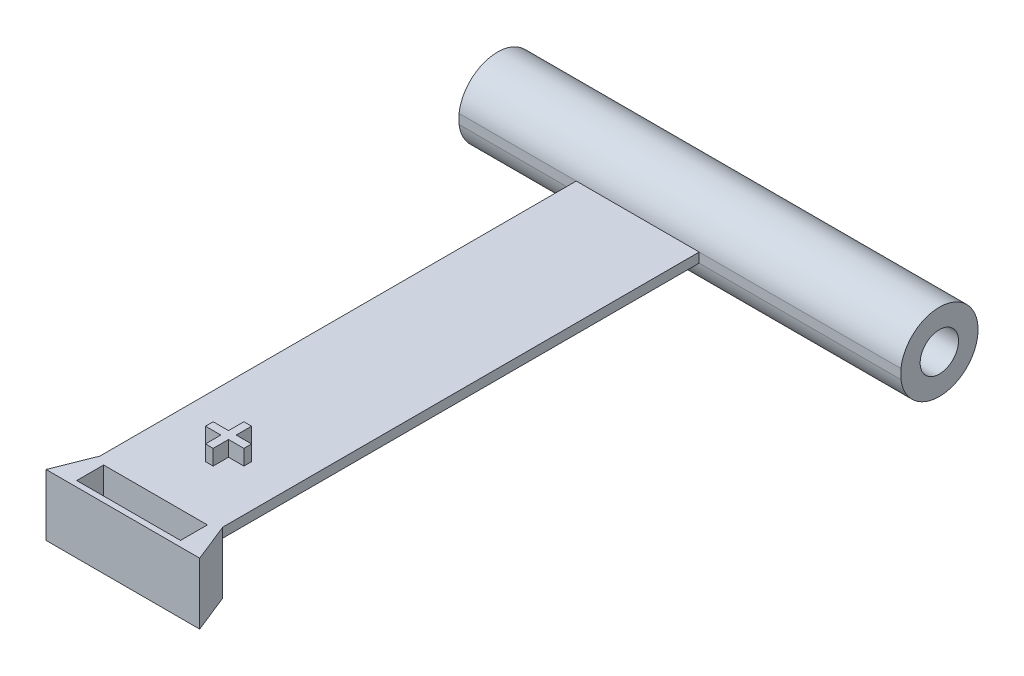
ISO-10303-21;
HEADER;
FILE_DESCRIPTION(('STEP AP214'),'2;1');
FILE_NAME('part.step','',(''),(''),'','','');
FILE_SCHEMA(('AUTOMOTIVE_DESIGN { 1 0 10303 214 1 1 1 1 }'));
ENDSEC;
DATA;
#1=APPLICATION_CONTEXT('core data for automotive mechanical design processes');
#2=APPLICATION_PROTOCOL_DEFINITION('international standard','automotive_design',2000,#1);
#3=PRODUCT_CONTEXT('',#1,'mechanical');
#4=PRODUCT('Part','Part','',(#3));
#5=PRODUCT_RELATED_PRODUCT_CATEGORY('part','',(#4));
#6=PRODUCT_DEFINITION_FORMATION('','',#4);
#7=PRODUCT_DEFINITION_CONTEXT('part definition',#1,'design');
#8=PRODUCT_DEFINITION('design','',#6,#7);
#9=PRODUCT_DEFINITION_SHAPE('','',#8);
#10=(LENGTH_UNIT() NAMED_UNIT(*) SI_UNIT(.MILLI.,.METRE.));
#11=(NAMED_UNIT(*) PLANE_ANGLE_UNIT() SI_UNIT($,.RADIAN.));
#12=(NAMED_UNIT(*) SI_UNIT($,.STERADIAN.) SOLID_ANGLE_UNIT());
#13=UNCERTAINTY_MEASURE_WITH_UNIT(LENGTH_MEASURE(1.E-05),#10,'distance_accuracy_value','');
#14=(GEOMETRIC_REPRESENTATION_CONTEXT(3) GLOBAL_UNCERTAINTY_ASSIGNED_CONTEXT((#13)) GLOBAL_UNIT_ASSIGNED_CONTEXT((#10,
#11,#12)) REPRESENTATION_CONTEXT('',''));
#15=CARTESIAN_POINT('',(0.,0.,0.));
#16=DIRECTION('',(0.,0.,1.));
#17=DIRECTION('',(1.,0.,0.));
#18=AXIS2_PLACEMENT_3D('',#15,#16,#17);
#19=CARTESIAN_POINT('',(0.,32.,0.));
#20=DIRECTION('',(0.,1.,0.));
#21=DIRECTION('',(0.,0.,1.));
#22=AXIS2_PLACEMENT_3D('',#19,#20,#21);
#23=PLANE('',#22);
#24=DIRECTION('',(0.,0.,-1.));
#25=VECTOR('',#24,1.);
#26=CARTESIAN_POINT('',(38.,32.,0.));
#27=LINE('',#26,#25);
#28=CARTESIAN_POINT('',(38.,32.,-45.));
#29=VERTEX_POINT('',#28);
#30=CARTESIAN_POINT('',(38.,32.,-53.));
#31=VERTEX_POINT('',#30);
#32=EDGE_CURVE('E248',#29,#31,#27,.T.);
#33=ORIENTED_EDGE('',*,*,#32,.T.);
#34=DIRECTION('',(-1.,0.,0.));
#35=VECTOR('',#34,1.);
#36=CARTESIAN_POINT('',(0.,32.,-53.));
#37=LINE('',#36,#35);
#38=CARTESIAN_POINT('',(30.,32.,-53.));
#39=VERTEX_POINT('',#38);
#40=EDGE_CURVE('E253',#31,#39,#37,.T.);
#41=ORIENTED_EDGE('',*,*,#40,.T.);
#42=DIRECTION('',(0.,0.,-1.));
#43=VECTOR('',#42,1.);
#44=CARTESIAN_POINT('',(30.,32.,0.));
#45=LINE('',#44,#43);
#46=CARTESIAN_POINT('',(30.,32.,-57.));
#47=VERTEX_POINT('',#46);
#48=EDGE_CURVE('E302',#39,#47,#45,.T.);
#49=ORIENTED_EDGE('',*,*,#48,.T.);
#50=DIRECTION('',(1.,0.,0.));
#51=VECTOR('',#50,1.);
#52=CARTESIAN_POINT('',(0.,32.,-57.));
#53=LINE('',#52,#51);
#54=CARTESIAN_POINT('',(38.,32.,-57.));
#55=VERTEX_POINT('',#54);
#56=EDGE_CURVE('E300',#47,#55,#53,.T.);
#57=ORIENTED_EDGE('',*,*,#56,.T.);
#58=DIRECTION('',(0.,0.,-1.));
#59=VECTOR('',#58,1.);
#60=CARTESIAN_POINT('',(38.,32.,0.));
#61=LINE('',#60,#59);
#62=CARTESIAN_POINT('',(38.,32.,-65.));
#63=VERTEX_POINT('',#62);
#64=EDGE_CURVE('E298',#55,#63,#61,.T.);
#65=ORIENTED_EDGE('',*,*,#64,.T.);
#66=DIRECTION('',(-1.,0.,0.));
#67=VECTOR('',#66,1.);
#68=CARTESIAN_POINT('',(0.,32.,-65.));
#69=LINE('',#68,#67);
#70=CARTESIAN_POINT('',(42.,32.,-65.));
#71=VERTEX_POINT('',#70);
#72=EDGE_CURVE('E295',#71,#63,#69,.T.);
#73=ORIENTED_EDGE('',*,*,#72,.F.);
#74=DIRECTION('',(0.,0.,-1.));
#75=VECTOR('',#74,1.);
#76=CARTESIAN_POINT('',(42.,32.,0.));
#77=LINE('',#76,#75);
#78=CARTESIAN_POINT('',(42.,32.,-57.));
#79=VERTEX_POINT('',#78);
#80=EDGE_CURVE('E292',#79,#71,#77,.T.);
#81=ORIENTED_EDGE('',*,*,#80,.F.);
#82=DIRECTION('',(1.,0.,0.));
#83=VECTOR('',#82,1.);
#84=CARTESIAN_POINT('',(0.,32.,-57.));
#85=LINE('',#84,#83);
#86=CARTESIAN_POINT('',(50.,32.,-57.));
#87=VERTEX_POINT('',#86);
#88=EDGE_CURVE('E290',#79,#87,#85,.T.);
#89=ORIENTED_EDGE('',*,*,#88,.T.);
#90=DIRECTION('',(0.,0.,1.));
#91=VECTOR('',#90,1.);
#92=CARTESIAN_POINT('',(50.,32.,0.));
#93=LINE('',#92,#91);
#94=CARTESIAN_POINT('',(50.,32.,-53.));
#95=VERTEX_POINT('',#94);
#96=EDGE_CURVE('E288',#87,#95,#93,.T.);
#97=ORIENTED_EDGE('',*,*,#96,.T.);
#98=DIRECTION('',(-1.,0.,0.));
#99=VECTOR('',#98,1.);
#100=CARTESIAN_POINT('',(0.,32.,-53.));
#101=LINE('',#100,#99);
#102=CARTESIAN_POINT('',(42.,32.,-53.));
#103=VERTEX_POINT('',#102);
#104=EDGE_CURVE('E286',#95,#103,#101,.T.);
#105=ORIENTED_EDGE('',*,*,#104,.T.);
#106=DIRECTION('',(0.,0.,-1.));
#107=VECTOR('',#106,1.);
#108=CARTESIAN_POINT('',(42.,32.,0.));
#109=LINE('',#108,#107);
#110=CARTESIAN_POINT('',(42.,32.,-45.));
#111=VERTEX_POINT('',#110);
#112=EDGE_CURVE('E59',#111,#103,#109,.T.);
#113=ORIENTED_EDGE('',*,*,#112,.F.);
#114=DIRECTION('',(1.,0.,0.));
#115=VECTOR('',#114,1.);
#116=CARTESIAN_POINT('',(0.,32.,-45.));
#117=LINE('',#116,#115);
#118=EDGE_CURVE('E54',#29,#111,#117,.T.);
#119=ORIENTED_EDGE('',*,*,#118,.F.);
#120=EDGE_LOOP('',(#33,#41,#49,#57,#65,#73,#81,#89,#97,#105,#113,#119));
#121=FACE_BOUND('',#120,.T.);
#122=DIRECTION('',(0.371390676354104,0.,0.928476690885259));
#123=VECTOR('',#122,1.);
#124=CARTESIAN_POINT('',(68.9655172413793,32.,-27.5862068965517));
#125=LINE('',#124,#123);
#126=CARTESIAN_POINT('',(72.,32.,-20.));
#127=VERTEX_POINT('',#126);
#128=CARTESIAN_POINT('',(80.,32.,0.));
#129=VERTEX_POINT('',#128);
#130=EDGE_CURVE('E387',#127,#129,#125,.T.);
#131=ORIENTED_EDGE('',*,*,#130,.F.);
#132=DIRECTION('',(0.,0.,1.));
#133=VECTOR('',#132,1.);
#134=CARTESIAN_POINT('',(72.,32.,-90.0000000000001));
#135=LINE('',#134,#133);
#136=CARTESIAN_POINT('',(72.,32.,-268.));
#137=VERTEX_POINT('',#136);
#138=EDGE_CURVE('E351',#137,#127,#135,.T.);
#139=ORIENTED_EDGE('',*,*,#138,.F.);
#140=DIRECTION('',(1.,0.,0.));
#141=VECTOR('',#140,1.);
#142=CARTESIAN_POINT('',(72.,32.,-268.));
#143=LINE('',#142,#141);
#144=CARTESIAN_POINT('',(8.,32.,-268.));
#145=VERTEX_POINT('',#144);
#146=EDGE_CURVE('E246',#145,#137,#143,.T.);
#147=ORIENTED_EDGE('',*,*,#146,.F.);
#148=DIRECTION('',(0.,0.,1.));
#149=VECTOR('',#148,1.);
#150=CARTESIAN_POINT('',(8.,32.,-90.0000000000001));
#151=LINE('',#150,#149);
#152=CARTESIAN_POINT('',(8.,32.,-20.));
#153=VERTEX_POINT('',#152);
#154=EDGE_CURVE('E342',#145,#153,#151,.T.);
#155=ORIENTED_EDGE('',*,*,#154,.T.);
#156=DIRECTION('',(0.371390676354104,0.,-0.928476690885259));
#157=VECTOR('',#156,1.);
#158=CARTESIAN_POINT('',(0.,32.,0.));
#159=LINE('',#158,#157);
#160=CARTESIAN_POINT('',(0.,32.,0.));
#161=VERTEX_POINT('',#160);
#162=EDGE_CURVE('E390',#161,#153,#159,.T.);
#163=ORIENTED_EDGE('',*,*,#162,.F.);
#164=DIRECTION('',(1.,0.,0.));
#165=VECTOR('',#164,1.);
#166=CARTESIAN_POINT('',(0.,32.,0.));
#167=LINE('',#166,#165);
#168=EDGE_CURVE('E393',#161,#129,#167,.T.);
#169=ORIENTED_EDGE('',*,*,#168,.T.);
#170=EDGE_LOOP('',(#131,#139,#147,#155,#163,#169));
#171=FACE_BOUND('',#170,.T.);
#172=DIRECTION('',(0.,0.,1.));
#173=VECTOR('',#172,1.);
#174=CARTESIAN_POINT('',(13.,32.,0.));
#175=LINE('',#174,#173);
#176=CARTESIAN_POINT('',(13.,32.,-17.));
#177=VERTEX_POINT('',#176);
#178=CARTESIAN_POINT('',(13.,32.,-3.));
#179=VERTEX_POINT('',#178);
#180=EDGE_CURVE('E369',#177,#179,#175,.T.);
#181=ORIENTED_EDGE('',*,*,#180,.F.);
#182=DIRECTION('',(1.,0.,0.));
#183=VECTOR('',#182,1.);
#184=CARTESIAN_POINT('',(0.,32.,-17.));
#185=LINE('',#184,#183);
#186=CARTESIAN_POINT('',(67.,32.,-17.));
#187=VERTEX_POINT('',#186);
#188=EDGE_CURVE('E354',#177,#187,#185,.T.);
#189=ORIENTED_EDGE('',*,*,#188,.T.);
#190=DIRECTION('',(0.,0.,1.));
#191=VECTOR('',#190,1.);
#192=CARTESIAN_POINT('',(67.,32.,0.));
#193=LINE('',#192,#191);
#194=CARTESIAN_POINT('',(67.,32.,-3.));
#195=VERTEX_POINT('',#194);
#196=EDGE_CURVE('E358',#187,#195,#193,.T.);
#197=ORIENTED_EDGE('',*,*,#196,.T.);
#198=DIRECTION('',(-1.,0.,0.));
#199=VECTOR('',#198,1.);
#200=CARTESIAN_POINT('',(0.,32.,-3.));
#201=LINE('',#200,#199);
#202=EDGE_CURVE('E372',#195,#179,#201,.T.);
#203=ORIENTED_EDGE('',*,*,#202,.T.);
#204=EDGE_LOOP('',(#181,#189,#197,#203));
#205=FACE_BOUND('',#204,.T.);
#206=ADVANCED_FACE('F39',(#121,#171,#205),#23,.T.);
#207=CARTESIAN_POINT('',(0.,0.,0.));
#208=DIRECTION('',(0.,1.,0.));
#209=DIRECTION('',(0.,0.,1.));
#210=AXIS2_PLACEMENT_3D('',#207,#208,#209);
#211=PLANE('',#210);
#212=DIRECTION('',(0.371390676354104,0.,0.928476690885259));
#213=VECTOR('',#212,1.);
#214=CARTESIAN_POINT('',(68.9655172413793,0.,-27.5862068965517));
#215=LINE('',#214,#213);
#216=CARTESIAN_POINT('',(72.,0.,-20.));
#217=VERTEX_POINT('',#216);
#218=CARTESIAN_POINT('',(80.,0.,0.));
#219=VERTEX_POINT('',#218);
#220=EDGE_CURVE('E380',#217,#219,#215,.T.);
#221=ORIENTED_EDGE('',*,*,#220,.T.);
#222=DIRECTION('',(1.,0.,0.));
#223=VECTOR('',#222,1.);
#224=CARTESIAN_POINT('',(0.,0.,0.));
#225=LINE('',#224,#223);
#226=CARTESIAN_POINT('',(0.,0.,0.));
#227=VERTEX_POINT('',#226);
#228=EDGE_CURVE('E391',#227,#219,#225,.T.);
#229=ORIENTED_EDGE('',*,*,#228,.F.);
#230=DIRECTION('',(0.371390676354104,0.,-0.928476690885259));
#231=VECTOR('',#230,1.);
#232=CARTESIAN_POINT('',(0.,0.,0.));
#233=LINE('',#232,#231);
#234=CARTESIAN_POINT('',(8.,0.,-20.));
#235=VERTEX_POINT('',#234);
#236=EDGE_CURVE('E401',#227,#235,#233,.T.);
#237=ORIENTED_EDGE('',*,*,#236,.T.);
#238=DIRECTION('',(1.,0.,0.));
#239=VECTOR('',#238,1.);
#240=CARTESIAN_POINT('',(0.,0.,-20.));
#241=LINE('',#240,#239);
#242=EDGE_CURVE('E398',#235,#217,#241,.T.);
#243=ORIENTED_EDGE('',*,*,#242,.T.);
#244=EDGE_LOOP('',(#221,#229,#237,#243));
#245=FACE_BOUND('',#244,.T.);
#246=DIRECTION('',(1.,0.,0.));
#247=VECTOR('',#246,1.);
#248=CARTESIAN_POINT('',(0.,0.,-17.));
#249=LINE('',#248,#247);
#250=CARTESIAN_POINT('',(13.,0.,-17.));
#251=VERTEX_POINT('',#250);
#252=CARTESIAN_POINT('',(67.,0.,-17.));
#253=VERTEX_POINT('',#252);
#254=EDGE_CURVE('E355',#251,#253,#249,.T.);
#255=ORIENTED_EDGE('',*,*,#254,.F.);
#256=DIRECTION('',(0.,0.,1.));
#257=VECTOR('',#256,1.);
#258=CARTESIAN_POINT('',(13.,0.,0.));
#259=LINE('',#258,#257);
#260=CARTESIAN_POINT('',(13.,0.,-3.));
#261=VERTEX_POINT('',#260);
#262=EDGE_CURVE('E357',#251,#261,#259,.T.);
#263=ORIENTED_EDGE('',*,*,#262,.T.);
#264=DIRECTION('',(-1.,0.,0.));
#265=VECTOR('',#264,1.);
#266=CARTESIAN_POINT('',(0.,0.,-3.));
#267=LINE('',#266,#265);
#268=CARTESIAN_POINT('',(67.,0.,-3.));
#269=VERTEX_POINT('',#268);
#270=EDGE_CURVE('E361',#269,#261,#267,.T.);
#271=ORIENTED_EDGE('',*,*,#270,.F.);
#272=DIRECTION('',(0.,0.,1.));
#273=VECTOR('',#272,1.);
#274=CARTESIAN_POINT('',(67.,0.,0.));
#275=LINE('',#274,#273);
#276=EDGE_CURVE('E364',#253,#269,#275,.T.);
#277=ORIENTED_EDGE('',*,*,#276,.F.);
#278=EDGE_LOOP('',(#255,#263,#271,#277));
#279=FACE_BOUND('',#278,.T.);
#280=ADVANCED_FACE('F422',(#245,#279),#211,.F.);
#281=CARTESIAN_POINT('',(68.9655172413793,32.,-27.5862068965517));
#282=DIRECTION('',(0.928476690885259,0.,-0.371390676354104));
#283=DIRECTION('',(-0.371390676354104,0.,-0.928476690885259));
#284=AXIS2_PLACEMENT_3D('',#281,#282,#283);
#285=PLANE('',#284);
#286=ORIENTED_EDGE('',*,*,#220,.F.);
#287=DIRECTION('',(0.,-1.,0.));
#288=VECTOR('',#287,1.);
#289=CARTESIAN_POINT('',(72.,32.,-20.));
#290=LINE('',#289,#288);
#291=CARTESIAN_POINT('',(72.,27.,-20.));
#292=VERTEX_POINT('',#291);
#293=EDGE_CURVE('E47',#292,#217,#290,.T.);
#294=ORIENTED_EDGE('',*,*,#293,.F.);
#295=EDGE_CURVE('E11',#127,#292,#290,.T.);
#296=ORIENTED_EDGE('',*,*,#295,.F.);
#297=ORIENTED_EDGE('',*,*,#130,.T.);
#298=DIRECTION('',(0.,-1.,0.));
#299=VECTOR('',#298,1.);
#300=CARTESIAN_POINT('',(80.,32.,0.));
#301=LINE('',#300,#299);
#302=EDGE_CURVE('E395',#129,#219,#301,.T.);
#303=ORIENTED_EDGE('',*,*,#302,.T.);
#304=EDGE_LOOP('',(#286,#294,#296,#297,#303));
#305=FACE_BOUND('',#304,.T.);
#306=ADVANCED_FACE('F41',(#305),#285,.T.);
#307=CARTESIAN_POINT('',(0.,32.,-20.));
#308=DIRECTION('',(0.,0.,-1.));
#309=DIRECTION('',(-1.,0.,0.));
#310=AXIS2_PLACEMENT_3D('',#307,#308,#309);
#311=PLANE('',#310);
#312=DIRECTION('',(-1.,0.,0.));
#313=VECTOR('',#312,1.);
#314=CARTESIAN_POINT('',(72.,27.,-20.));
#315=LINE('',#314,#313);
#316=CARTESIAN_POINT('',(8.,27.,-20.));
#317=VERTEX_POINT('',#316);
#318=EDGE_CURVE('E339',#292,#317,#315,.T.);
#319=ORIENTED_EDGE('',*,*,#318,.F.);
#320=ORIENTED_EDGE('',*,*,#293,.T.);
#321=ORIENTED_EDGE('',*,*,#242,.F.);
#322=DIRECTION('',(0.,-1.,0.));
#323=VECTOR('',#322,1.);
#324=CARTESIAN_POINT('',(8.,32.,-20.));
#325=LINE('',#324,#323);
#326=EDGE_CURVE('E408',#317,#235,#325,.T.);
#327=ORIENTED_EDGE('',*,*,#326,.F.);
#328=EDGE_LOOP('',(#319,#320,#321,#327));
#329=FACE_BOUND('',#328,.T.);
#330=ADVANCED_FACE('F417',(#329),#311,.T.);
#331=CARTESIAN_POINT('',(0.,32.,0.));
#332=DIRECTION('',(-0.928476690885259,0.,-0.371390676354104));
#333=DIRECTION('',(-0.371390676354104,0.,0.928476690885259));
#334=AXIS2_PLACEMENT_3D('',#331,#332,#333);
#335=PLANE('',#334);
#336=ORIENTED_EDGE('',*,*,#236,.F.);
#337=DIRECTION('',(0.,-1.,0.));
#338=VECTOR('',#337,1.);
#339=CARTESIAN_POINT('',(0.,32.,0.));
#340=LINE('',#339,#338);
#341=EDGE_CURVE('E407',#161,#227,#340,.T.);
#342=ORIENTED_EDGE('',*,*,#341,.F.);
#343=ORIENTED_EDGE('',*,*,#162,.T.);
#344=EDGE_CURVE('E409',#153,#317,#325,.T.);
#345=ORIENTED_EDGE('',*,*,#344,.T.);
#346=ORIENTED_EDGE('',*,*,#326,.T.);
#347=EDGE_LOOP('',(#336,#342,#343,#345,#346));
#348=FACE_BOUND('',#347,.T.);
#349=ADVANCED_FACE('F415',(#348),#335,.T.);
#350=CARTESIAN_POINT('',(0.,32.,0.));
#351=DIRECTION('',(0.,0.,-1.));
#352=DIRECTION('',(-1.,0.,0.));
#353=AXIS2_PLACEMENT_3D('',#350,#351,#352);
#354=PLANE('',#353);
#355=ORIENTED_EDGE('',*,*,#228,.T.);
#356=ORIENTED_EDGE('',*,*,#302,.F.);
#357=ORIENTED_EDGE('',*,*,#168,.F.);
#358=ORIENTED_EDGE('',*,*,#341,.T.);
#359=EDGE_LOOP('',(#355,#356,#357,#358));
#360=FACE_BOUND('',#359,.T.);
#361=ADVANCED_FACE('F426',(#360),#354,.F.);
#362=CARTESIAN_POINT('',(0.,0.,-17.));
#363=DIRECTION('',(0.,0.,1.));
#364=DIRECTION('',(1.,0.,0.));
#365=AXIS2_PLACEMENT_3D('',#362,#363,#364);
#366=PLANE('',#365);
#367=ORIENTED_EDGE('',*,*,#188,.F.);
#368=DIRECTION('',(0.,1.,0.));
#369=VECTOR('',#368,1.);
#370=CARTESIAN_POINT('',(13.,0.,-17.));
#371=LINE('',#370,#369);
#372=EDGE_CURVE('E366',#251,#177,#371,.T.);
#373=ORIENTED_EDGE('',*,*,#372,.F.);
#374=ORIENTED_EDGE('',*,*,#254,.T.);
#375=DIRECTION('',(0.,1.,0.));
#376=VECTOR('',#375,1.);
#377=CARTESIAN_POINT('',(67.,0.,-17.));
#378=LINE('',#377,#376);
#379=EDGE_CURVE('E377',#253,#187,#378,.T.);
#380=ORIENTED_EDGE('',*,*,#379,.T.);
#381=EDGE_LOOP('',(#367,#373,#374,#380));
#382=FACE_BOUND('',#381,.T.);
#383=ADVANCED_FACE('F462',(#382),#366,.T.);
#384=CARTESIAN_POINT('',(67.,0.,0.));
#385=DIRECTION('',(-1.,0.,0.));
#386=DIRECTION('',(0.,0.,1.));
#387=AXIS2_PLACEMENT_3D('',#384,#385,#386);
#388=PLANE('',#387);
#389=ORIENTED_EDGE('',*,*,#196,.F.);
#390=ORIENTED_EDGE('',*,*,#379,.F.);
#391=ORIENTED_EDGE('',*,*,#276,.T.);
#392=DIRECTION('',(0.,1.,0.));
#393=VECTOR('',#392,1.);
#394=CARTESIAN_POINT('',(67.,0.,-3.));
#395=LINE('',#394,#393);
#396=EDGE_CURVE('E381',#269,#195,#395,.T.);
#397=ORIENTED_EDGE('',*,*,#396,.T.);
#398=EDGE_LOOP('',(#389,#390,#391,#397));
#399=FACE_BOUND('',#398,.T.);
#400=ADVANCED_FACE('F492',(#399),#388,.T.);
#401=CARTESIAN_POINT('',(0.,0.,-3.));
#402=DIRECTION('',(0.,0.,-1.));
#403=DIRECTION('',(-1.,0.,0.));
#404=AXIS2_PLACEMENT_3D('',#401,#402,#403);
#405=PLANE('',#404);
#406=ORIENTED_EDGE('',*,*,#202,.F.);
#407=ORIENTED_EDGE('',*,*,#396,.F.);
#408=ORIENTED_EDGE('',*,*,#270,.T.);
#409=DIRECTION('',(0.,1.,0.));
#410=VECTOR('',#409,1.);
#411=CARTESIAN_POINT('',(13.,0.,-3.));
#412=LINE('',#411,#410);
#413=EDGE_CURVE('E383',#261,#179,#412,.T.);
#414=ORIENTED_EDGE('',*,*,#413,.T.);
#415=EDGE_LOOP('',(#406,#407,#408,#414));
#416=FACE_BOUND('',#415,.T.);
#417=ADVANCED_FACE('F495',(#416),#405,.T.);
#418=CARTESIAN_POINT('',(13.,0.,0.));
#419=DIRECTION('',(-1.,0.,0.));
#420=DIRECTION('',(0.,0.,1.));
#421=AXIS2_PLACEMENT_3D('',#418,#419,#420);
#422=PLANE('',#421);
#423=ORIENTED_EDGE('',*,*,#180,.T.);
#424=ORIENTED_EDGE('',*,*,#413,.F.);
#425=ORIENTED_EDGE('',*,*,#262,.F.);
#426=ORIENTED_EDGE('',*,*,#372,.T.);
#427=EDGE_LOOP('',(#423,#424,#425,#426));
#428=FACE_BOUND('',#427,.T.);
#429=ADVANCED_FACE('F488',(#428),#422,.F.);
#430=CARTESIAN_POINT('',(72.,32.,-90.0000000000001));
#431=DIRECTION('',(-1.,0.,0.));
#432=DIRECTION('',(0.,0.,1.));
#433=AXIS2_PLACEMENT_3D('',#430,#431,#432);
#434=PLANE('',#433);
#435=ORIENTED_EDGE('',*,*,#295,.T.);
#436=DIRECTION('',(0.,0.,1.));
#437=VECTOR('',#436,1.);
#438=CARTESIAN_POINT('',(72.,27.,-90.0000000000001));
#439=LINE('',#438,#437);
#440=CARTESIAN_POINT('',(72.,27.,-268.));
#441=VERTEX_POINT('',#440);
#442=EDGE_CURVE('E348',#441,#292,#439,.T.);
#443=ORIENTED_EDGE('',*,*,#442,.F.);
#444=DIRECTION('',(0.,-1.,0.));
#445=VECTOR('',#444,1.);
#446=CARTESIAN_POINT('',(72.,27.,-268.));
#447=LINE('',#446,#445);
#448=EDGE_CURVE('E211',#137,#441,#447,.T.);
#449=ORIENTED_EDGE('',*,*,#448,.F.);
#450=ORIENTED_EDGE('',*,*,#138,.T.);
#451=EDGE_LOOP('',(#435,#443,#449,#450));
#452=FACE_BOUND('',#451,.T.);
#453=ADVANCED_FACE('F476',(#452),#434,.F.);
#454=CARTESIAN_POINT('',(72.,27.,-90.0000000000001));
#455=DIRECTION('',(0.,1.,0.));
#456=DIRECTION('',(0.,0.,1.));
#457=AXIS2_PLACEMENT_3D('',#454,#455,#456);
#458=PLANE('',#457);
#459=ORIENTED_EDGE('',*,*,#318,.T.);
#460=DIRECTION('',(0.,0.,1.));
#461=VECTOR('',#460,1.);
#462=CARTESIAN_POINT('',(8.,27.,-90.0000000000001));
#463=LINE('',#462,#461);
#464=CARTESIAN_POINT('',(8.,27.,-268.));
#465=VERTEX_POINT('',#464);
#466=EDGE_CURVE('E345',#465,#317,#463,.T.);
#467=ORIENTED_EDGE('',*,*,#466,.F.);
#468=DIRECTION('',(-1.,0.,0.));
#469=VECTOR('',#468,1.);
#470=CARTESIAN_POINT('',(72.,27.,-268.));
#471=LINE('',#470,#469);
#472=EDGE_CURVE('E241',#441,#465,#471,.T.);
#473=ORIENTED_EDGE('',*,*,#472,.F.);
#474=ORIENTED_EDGE('',*,*,#442,.T.);
#475=EDGE_LOOP('',(#459,#467,#473,#474));
#476=FACE_BOUND('',#475,.T.);
#477=ADVANCED_FACE('F479',(#476),#458,.F.);
#478=CARTESIAN_POINT('',(8.,27.,-90.0000000000001));
#479=DIRECTION('',(1.,0.,0.));
#480=DIRECTION('',(0.,1.,0.));
#481=AXIS2_PLACEMENT_3D('',#478,#479,#480);
#482=PLANE('',#481);
#483=ORIENTED_EDGE('',*,*,#344,.F.);
#484=ORIENTED_EDGE('',*,*,#154,.F.);
#485=DIRECTION('',(0.,1.,0.));
#486=VECTOR('',#485,1.);
#487=CARTESIAN_POINT('',(8.,27.,-268.));
#488=LINE('',#487,#486);
#489=EDGE_CURVE('E243',#465,#145,#488,.T.);
#490=ORIENTED_EDGE('',*,*,#489,.F.);
#491=ORIENTED_EDGE('',*,*,#466,.T.);
#492=EDGE_LOOP('',(#483,#484,#490,#491));
#493=FACE_BOUND('',#492,.T.);
#494=ADVANCED_FACE('F431',(#493),#482,.F.);
#495=CARTESIAN_POINT('',(38.,40.,0.));
#496=DIRECTION('',(-1.,0.,0.));
#497=DIRECTION('',(0.,0.,1.));
#498=AXIS2_PLACEMENT_3D('',#495,#496,#497);
#499=PLANE('',#498);
#500=ORIENTED_EDGE('',*,*,#32,.F.);
#501=DIRECTION('',(0.,-1.,0.));
#502=VECTOR('',#501,1.);
#503=CARTESIAN_POINT('',(38.,40.,-45.));
#504=LINE('',#503,#502);
#505=CARTESIAN_POINT('',(38.,40.,-45.));
#506=VERTEX_POINT('',#505);
#507=EDGE_CURVE('E337',#506,#29,#504,.T.);
#508=ORIENTED_EDGE('',*,*,#507,.F.);
#509=DIRECTION('',(0.,0.,-1.));
#510=VECTOR('',#509,1.);
#511=CARTESIAN_POINT('',(38.,40.,0.));
#512=LINE('',#511,#510);
#513=CARTESIAN_POINT('',(38.,40.,-53.));
#514=VERTEX_POINT('',#513);
#515=EDGE_CURVE('E249',#506,#514,#512,.T.);
#516=ORIENTED_EDGE('',*,*,#515,.T.);
#517=DIRECTION('',(0.,-1.,0.));
#518=VECTOR('',#517,1.);
#519=CARTESIAN_POINT('',(38.,40.,-53.));
#520=LINE('',#519,#518);
#521=EDGE_CURVE('E282',#514,#31,#520,.T.);
#522=ORIENTED_EDGE('',*,*,#521,.T.);
#523=EDGE_LOOP('',(#500,#508,#516,#522));
#524=FACE_BOUND('',#523,.T.);
#525=ADVANCED_FACE('F486',(#524),#499,.T.);
#526=CARTESIAN_POINT('',(0.,40.,-45.));
#527=DIRECTION('',(0.,0.,-1.));
#528=DIRECTION('',(-1.,0.,0.));
#529=AXIS2_PLACEMENT_3D('',#526,#527,#528);
#530=PLANE('',#529);
#531=ORIENTED_EDGE('',*,*,#118,.T.);
#532=DIRECTION('',(0.,-1.,0.));
#533=VECTOR('',#532,1.);
#534=CARTESIAN_POINT('',(42.,40.,-45.));
#535=LINE('',#534,#533);
#536=CARTESIAN_POINT('',(42.,40.,-45.));
#537=VERTEX_POINT('',#536);
#538=EDGE_CURVE('E334',#537,#111,#535,.T.);
#539=ORIENTED_EDGE('',*,*,#538,.F.);
#540=DIRECTION('',(1.,0.,0.));
#541=VECTOR('',#540,1.);
#542=CARTESIAN_POINT('',(0.,40.,-45.));
#543=LINE('',#542,#541);
#544=EDGE_CURVE('E252',#506,#537,#543,.T.);
#545=ORIENTED_EDGE('',*,*,#544,.F.);
#546=ORIENTED_EDGE('',*,*,#507,.T.);
#547=EDGE_LOOP('',(#531,#539,#545,#546));
#548=FACE_BOUND('',#547,.T.);
#549=ADVANCED_FACE('F560',(#548),#530,.F.);
#550=CARTESIAN_POINT('',(42.,40.,0.));
#551=DIRECTION('',(-1.,0.,0.));
#552=DIRECTION('',(0.,0.,1.));
#553=AXIS2_PLACEMENT_3D('',#550,#551,#552);
#554=PLANE('',#553);
#555=ORIENTED_EDGE('',*,*,#112,.T.);
#556=DIRECTION('',(0.,-1.,0.));
#557=VECTOR('',#556,1.);
#558=CARTESIAN_POINT('',(42.,40.,-53.));
#559=LINE('',#558,#557);
#560=CARTESIAN_POINT('',(42.,40.,-53.));
#561=VERTEX_POINT('',#560);
#562=EDGE_CURVE('E331',#561,#103,#559,.T.);
#563=ORIENTED_EDGE('',*,*,#562,.F.);
#564=DIRECTION('',(0.,0.,-1.));
#565=VECTOR('',#564,1.);
#566=CARTESIAN_POINT('',(42.,40.,0.));
#567=LINE('',#566,#565);
#568=EDGE_CURVE('E255',#537,#561,#567,.T.);
#569=ORIENTED_EDGE('',*,*,#568,.F.);
#570=ORIENTED_EDGE('',*,*,#538,.T.);
#571=EDGE_LOOP('',(#555,#563,#569,#570));
#572=FACE_BOUND('',#571,.T.);
#573=ADVANCED_FACE('F572',(#572),#554,.F.);
#574=CARTESIAN_POINT('',(0.,40.,-53.));
#575=DIRECTION('',(0.,0.,1.));
#576=DIRECTION('',(1.,0.,0.));
#577=AXIS2_PLACEMENT_3D('',#574,#575,#576);
#578=PLANE('',#577);
#579=ORIENTED_EDGE('',*,*,#104,.F.);
#580=DIRECTION('',(0.,-1.,0.));
#581=VECTOR('',#580,1.);
#582=CARTESIAN_POINT('',(50.,40.,-53.));
#583=LINE('',#582,#581);
#584=CARTESIAN_POINT('',(50.,40.,-53.));
#585=VERTEX_POINT('',#584);
#586=EDGE_CURVE('E328',#585,#95,#583,.T.);
#587=ORIENTED_EDGE('',*,*,#586,.F.);
#588=DIRECTION('',(-1.,0.,0.));
#589=VECTOR('',#588,1.);
#590=CARTESIAN_POINT('',(0.,40.,-53.));
#591=LINE('',#590,#589);
#592=EDGE_CURVE('E257',#585,#561,#591,.T.);
#593=ORIENTED_EDGE('',*,*,#592,.T.);
#594=ORIENTED_EDGE('',*,*,#562,.T.);
#595=EDGE_LOOP('',(#579,#587,#593,#594));
#596=FACE_BOUND('',#595,.T.);
#597=ADVANCED_FACE('F582',(#596),#578,.T.);
#598=CARTESIAN_POINT('',(50.,40.,0.));
#599=DIRECTION('',(1.,0.,0.));
#600=DIRECTION('',(0.,0.,-1.));
#601=AXIS2_PLACEMENT_3D('',#598,#599,#600);
#602=PLANE('',#601);
#603=ORIENTED_EDGE('',*,*,#96,.F.);
#604=DIRECTION('',(0.,-1.,0.));
#605=VECTOR('',#604,1.);
#606=CARTESIAN_POINT('',(50.,40.,-57.));
#607=LINE('',#606,#605);
#608=CARTESIAN_POINT('',(50.,40.,-57.));
#609=VERTEX_POINT('',#608);
#610=EDGE_CURVE('E325',#609,#87,#607,.T.);
#611=ORIENTED_EDGE('',*,*,#610,.F.);
#612=DIRECTION('',(0.,0.,1.));
#613=VECTOR('',#612,1.);
#614=CARTESIAN_POINT('',(50.,40.,0.));
#615=LINE('',#614,#613);
#616=EDGE_CURVE('E260',#609,#585,#615,.T.);
#617=ORIENTED_EDGE('',*,*,#616,.T.);
#618=ORIENTED_EDGE('',*,*,#586,.T.);
#619=EDGE_LOOP('',(#603,#611,#617,#618));
#620=FACE_BOUND('',#619,.T.);
#621=ADVANCED_FACE('F593',(#620),#602,.T.);
#622=CARTESIAN_POINT('',(0.,40.,-57.));
#623=DIRECTION('',(0.,0.,-1.));
#624=DIRECTION('',(-1.,0.,0.));
#625=AXIS2_PLACEMENT_3D('',#622,#623,#624);
#626=PLANE('',#625);
#627=ORIENTED_EDGE('',*,*,#88,.F.);
#628=DIRECTION('',(0.,-1.,0.));
#629=VECTOR('',#628,1.);
#630=CARTESIAN_POINT('',(42.,40.,-57.));
#631=LINE('',#630,#629);
#632=CARTESIAN_POINT('',(42.,40.,-57.));
#633=VERTEX_POINT('',#632);
#634=EDGE_CURVE('E322',#633,#79,#631,.T.);
#635=ORIENTED_EDGE('',*,*,#634,.F.);
#636=DIRECTION('',(1.,0.,0.));
#637=VECTOR('',#636,1.);
#638=CARTESIAN_POINT('',(0.,40.,-57.));
#639=LINE('',#638,#637);
#640=EDGE_CURVE('E263',#633,#609,#639,.T.);
#641=ORIENTED_EDGE('',*,*,#640,.T.);
#642=ORIENTED_EDGE('',*,*,#610,.T.);
#643=EDGE_LOOP('',(#627,#635,#641,#642));
#644=FACE_BOUND('',#643,.T.);
#645=ADVANCED_FACE('F604',(#644),#626,.T.);
#646=CARTESIAN_POINT('',(42.,40.,0.));
#647=DIRECTION('',(-1.,0.,0.));
#648=DIRECTION('',(0.,0.,1.));
#649=AXIS2_PLACEMENT_3D('',#646,#647,#648);
#650=PLANE('',#649);
#651=ORIENTED_EDGE('',*,*,#80,.T.);
#652=DIRECTION('',(0.,-1.,0.));
#653=VECTOR('',#652,1.);
#654=CARTESIAN_POINT('',(42.,40.,-65.));
#655=LINE('',#654,#653);
#656=CARTESIAN_POINT('',(42.,40.,-65.));
#657=VERTEX_POINT('',#656);
#658=EDGE_CURVE('E319',#657,#71,#655,.T.);
#659=ORIENTED_EDGE('',*,*,#658,.F.);
#660=DIRECTION('',(0.,0.,-1.));
#661=VECTOR('',#660,1.);
#662=CARTESIAN_POINT('',(42.,40.,0.));
#663=LINE('',#662,#661);
#664=EDGE_CURVE('E266',#633,#657,#663,.T.);
#665=ORIENTED_EDGE('',*,*,#664,.F.);
#666=ORIENTED_EDGE('',*,*,#634,.T.);
#667=EDGE_LOOP('',(#651,#659,#665,#666));
#668=FACE_BOUND('',#667,.T.);
#669=ADVANCED_FACE('F615',(#668),#650,.F.);
#670=CARTESIAN_POINT('',(0.,40.,-65.));
#671=DIRECTION('',(0.,0.,1.));
#672=DIRECTION('',(1.,0.,0.));
#673=AXIS2_PLACEMENT_3D('',#670,#671,#672);
#674=PLANE('',#673);
#675=ORIENTED_EDGE('',*,*,#72,.T.);
#676=DIRECTION('',(0.,-1.,0.));
#677=VECTOR('',#676,1.);
#678=CARTESIAN_POINT('',(38.,40.,-65.));
#679=LINE('',#678,#677);
#680=CARTESIAN_POINT('',(38.,40.,-65.));
#681=VERTEX_POINT('',#680);
#682=EDGE_CURVE('E316',#681,#63,#679,.T.);
#683=ORIENTED_EDGE('',*,*,#682,.F.);
#684=DIRECTION('',(-1.,0.,0.));
#685=VECTOR('',#684,1.);
#686=CARTESIAN_POINT('',(0.,40.,-65.));
#687=LINE('',#686,#685);
#688=EDGE_CURVE('E268',#657,#681,#687,.T.);
#689=ORIENTED_EDGE('',*,*,#688,.F.);
#690=ORIENTED_EDGE('',*,*,#658,.T.);
#691=EDGE_LOOP('',(#675,#683,#689,#690));
#692=FACE_BOUND('',#691,.T.);
#693=ADVANCED_FACE('F626',(#692),#674,.F.);
#694=CARTESIAN_POINT('',(38.,40.,0.));
#695=DIRECTION('',(-1.,0.,0.));
#696=DIRECTION('',(0.,0.,1.));
#697=AXIS2_PLACEMENT_3D('',#694,#695,#696);
#698=PLANE('',#697);
#699=ORIENTED_EDGE('',*,*,#64,.F.);
#700=DIRECTION('',(0.,-1.,0.));
#701=VECTOR('',#700,1.);
#702=CARTESIAN_POINT('',(38.,40.,-57.));
#703=LINE('',#702,#701);
#704=CARTESIAN_POINT('',(38.,40.,-57.));
#705=VERTEX_POINT('',#704);
#706=EDGE_CURVE('E313',#705,#55,#703,.T.);
#707=ORIENTED_EDGE('',*,*,#706,.F.);
#708=DIRECTION('',(0.,0.,-1.));
#709=VECTOR('',#708,1.);
#710=CARTESIAN_POINT('',(38.,40.,0.));
#711=LINE('',#710,#709);
#712=EDGE_CURVE('E270',#705,#681,#711,.T.);
#713=ORIENTED_EDGE('',*,*,#712,.T.);
#714=ORIENTED_EDGE('',*,*,#682,.T.);
#715=EDGE_LOOP('',(#699,#707,#713,#714));
#716=FACE_BOUND('',#715,.T.);
#717=ADVANCED_FACE('F638',(#716),#698,.T.);
#718=CARTESIAN_POINT('',(0.,40.,-57.));
#719=DIRECTION('',(0.,0.,-1.));
#720=DIRECTION('',(-1.,0.,0.));
#721=AXIS2_PLACEMENT_3D('',#718,#719,#720);
#722=PLANE('',#721);
#723=ORIENTED_EDGE('',*,*,#56,.F.);
#724=DIRECTION('',(0.,-1.,0.));
#725=VECTOR('',#724,1.);
#726=CARTESIAN_POINT('',(30.,40.,-57.));
#727=LINE('',#726,#725);
#728=CARTESIAN_POINT('',(30.,40.,-57.));
#729=VERTEX_POINT('',#728);
#730=EDGE_CURVE('E310',#729,#47,#727,.T.);
#731=ORIENTED_EDGE('',*,*,#730,.F.);
#732=DIRECTION('',(1.,0.,0.));
#733=VECTOR('',#732,1.);
#734=CARTESIAN_POINT('',(0.,40.,-57.));
#735=LINE('',#734,#733);
#736=EDGE_CURVE('E273',#729,#705,#735,.T.);
#737=ORIENTED_EDGE('',*,*,#736,.T.);
#738=ORIENTED_EDGE('',*,*,#706,.T.);
#739=EDGE_LOOP('',(#723,#731,#737,#738));
#740=FACE_BOUND('',#739,.T.);
#741=ADVANCED_FACE('F648',(#740),#722,.T.);
#742=CARTESIAN_POINT('',(30.,40.,0.));
#743=DIRECTION('',(-1.,0.,0.));
#744=DIRECTION('',(0.,0.,1.));
#745=AXIS2_PLACEMENT_3D('',#742,#743,#744);
#746=PLANE('',#745);
#747=ORIENTED_EDGE('',*,*,#48,.F.);
#748=DIRECTION('',(0.,-1.,0.));
#749=VECTOR('',#748,1.);
#750=CARTESIAN_POINT('',(30.,40.,-53.));
#751=LINE('',#750,#749);
#752=CARTESIAN_POINT('',(30.,40.,-53.));
#753=VERTEX_POINT('',#752);
#754=EDGE_CURVE('E307',#753,#39,#751,.T.);
#755=ORIENTED_EDGE('',*,*,#754,.F.);
#756=DIRECTION('',(0.,0.,-1.));
#757=VECTOR('',#756,1.);
#758=CARTESIAN_POINT('',(30.,40.,0.));
#759=LINE('',#758,#757);
#760=EDGE_CURVE('E276',#753,#729,#759,.T.);
#761=ORIENTED_EDGE('',*,*,#760,.T.);
#762=ORIENTED_EDGE('',*,*,#730,.T.);
#763=EDGE_LOOP('',(#747,#755,#761,#762));
#764=FACE_BOUND('',#763,.T.);
#765=ADVANCED_FACE('F659',(#764),#746,.T.);
#766=CARTESIAN_POINT('',(0.,40.,-53.));
#767=DIRECTION('',(0.,0.,1.));
#768=DIRECTION('',(1.,0.,0.));
#769=AXIS2_PLACEMENT_3D('',#766,#767,#768);
#770=PLANE('',#769);
#771=ORIENTED_EDGE('',*,*,#40,.F.);
#772=ORIENTED_EDGE('',*,*,#521,.F.);
#773=DIRECTION('',(-1.,0.,0.));
#774=VECTOR('',#773,1.);
#775=CARTESIAN_POINT('',(0.,40.,-53.));
#776=LINE('',#775,#774);
#777=EDGE_CURVE('E279',#514,#753,#776,.T.);
#778=ORIENTED_EDGE('',*,*,#777,.T.);
#779=ORIENTED_EDGE('',*,*,#754,.T.);
#780=EDGE_LOOP('',(#771,#772,#778,#779));
#781=FACE_BOUND('',#780,.T.);
#782=ADVANCED_FACE('F670',(#781),#770,.T.);
#783=CARTESIAN_POINT('',(0.,40.,0.));
#784=DIRECTION('',(0.,1.,0.));
#785=DIRECTION('',(0.,0.,1.));
#786=AXIS2_PLACEMENT_3D('',#783,#784,#785);
#787=PLANE('',#786);
#788=ORIENTED_EDGE('',*,*,#515,.F.);
#789=ORIENTED_EDGE('',*,*,#544,.T.);
#790=ORIENTED_EDGE('',*,*,#568,.T.);
#791=ORIENTED_EDGE('',*,*,#592,.F.);
#792=ORIENTED_EDGE('',*,*,#616,.F.);
#793=ORIENTED_EDGE('',*,*,#640,.F.);
#794=ORIENTED_EDGE('',*,*,#664,.T.);
#795=ORIENTED_EDGE('',*,*,#688,.T.);
#796=ORIENTED_EDGE('',*,*,#712,.F.);
#797=ORIENTED_EDGE('',*,*,#736,.F.);
#798=ORIENTED_EDGE('',*,*,#760,.F.);
#799=ORIENTED_EDGE('',*,*,#777,.F.);
#800=EDGE_LOOP('',(#788,#789,#790,#791,#792,#793,#794,#795,#796,#797,#798,#799));
#801=FACE_BOUND('',#800,.T.);
#802=ADVANCED_FACE('F681',(#801),#787,.T.);
#803=CARTESIAN_POINT('',(-53.,0.,-268.));
#804=DIRECTION('',(0.,0.,-1.));
#805=DIRECTION('',(-1.,0.,0.));
#806=AXIS2_PLACEMENT_3D('',#803,#804,#805);
#807=PLANE('',#806);
#808=DIRECTION('',(1.,0.,0.));
#809=VECTOR('',#808,1.);
#810=CARTESIAN_POINT('',(-53.,32.,-268.));
#811=LINE('',#810,#809);
#812=CARTESIAN_POINT('',(177.,32.,-268.));
#813=VERTEX_POINT('',#812);
#814=EDGE_CURVE('E222',#137,#813,#811,.T.);
#815=ORIENTED_EDGE('',*,*,#814,.F.);
#816=ORIENTED_EDGE('',*,*,#448,.T.);
#817=DIRECTION('',(1.,0.,0.));
#818=VECTOR('',#817,1.);
#819=CARTESIAN_POINT('',(-53.,27.,-268.));
#820=LINE('',#819,#818);
#821=CARTESIAN_POINT('',(177.,27.,-268.));
#822=VERTEX_POINT('',#821);
#823=EDGE_CURVE('E205',#441,#822,#820,.T.);
#824=ORIENTED_EDGE('',*,*,#823,.T.);
#825=DIRECTION('',(0.,1.,0.));
#826=VECTOR('',#825,1.);
#827=CARTESIAN_POINT('',(177.,0.,-268.));
#828=LINE('',#827,#826);
#829=EDGE_CURVE('E210',#822,#813,#828,.T.);
#830=ORIENTED_EDGE('',*,*,#829,.T.);
#831=EDGE_LOOP('',(#815,#816,#824,#830));
#832=FACE_BOUND('',#831,.T.);
#833=ADVANCED_FACE('F208',(#832),#807,.F.);
#834=CARTESIAN_POINT('',(-53.,27.,-268.));
#835=VERTEX_POINT('',#834);
#836=EDGE_CURVE('E214',#835,#465,#820,.T.);
#837=ORIENTED_EDGE('',*,*,#836,.T.);
#838=ORIENTED_EDGE('',*,*,#489,.T.);
#839=CARTESIAN_POINT('',(-53.,32.,-268.));
#840=VERTEX_POINT('',#839);
#841=EDGE_CURVE('E237',#840,#145,#811,.T.);
#842=ORIENTED_EDGE('',*,*,#841,.F.);
#843=DIRECTION('',(0.,1.,0.));
#844=VECTOR('',#843,1.);
#845=CARTESIAN_POINT('',(-53.,0.,-268.));
#846=LINE('',#845,#844);
#847=EDGE_CURVE('E224',#835,#840,#846,.T.);
#848=ORIENTED_EDGE('',*,*,#847,.F.);
#849=EDGE_LOOP('',(#837,#838,#842,#848));
#850=FACE_BOUND('',#849,.T.);
#851=ADVANCED_FACE('F439',(#850),#807,.F.);
#852=CARTESIAN_POINT('',(-53.,29.5,-288.));
#853=DIRECTION('',(1.,0.,0.));
#854=DIRECTION('',(0.,0.,-1.));
#855=AXIS2_PLACEMENT_3D('',#852,#853,#854);
#856=CYLINDRICAL_SURFACE('',#855,20.1556443707464);
#857=ORIENTED_EDGE('',*,*,#841,.T.);
#858=ORIENTED_EDGE('',*,*,#146,.T.);
#859=ORIENTED_EDGE('',*,*,#814,.T.);
#860=CARTESIAN_POINT('',(177.,29.5,-288.));
#861=DIRECTION('',(1.,0.,0.));
#862=DIRECTION('',(0.,0.,-1.));
#863=AXIS2_PLACEMENT_3D('',#860,#861,#862);
#864=CIRCLE('',#863,20.1556443707464);
#865=EDGE_CURVE('E218',#822,#813,#864,.T.);
#866=ORIENTED_EDGE('',*,*,#865,.F.);
#867=ORIENTED_EDGE('',*,*,#823,.F.);
#868=ORIENTED_EDGE('',*,*,#472,.T.);
#869=ORIENTED_EDGE('',*,*,#836,.F.);
#870=CARTESIAN_POINT('',(-53.,29.5,-288.));
#871=DIRECTION('',(1.,0.,0.));
#872=DIRECTION('',(0.,0.,-1.));
#873=AXIS2_PLACEMENT_3D('',#870,#871,#872);
#874=CIRCLE('',#873,20.1556443707464);
#875=EDGE_CURVE('E215',#835,#840,#874,.T.);
#876=ORIENTED_EDGE('',*,*,#875,.T.);
#877=EDGE_LOOP('',(#857,#858,#859,#866,#867,#868,#869,#876));
#878=FACE_BOUND('',#877,.T.);
#879=ADVANCED_FACE('F220',(#878),#856,.T.);
#880=CARTESIAN_POINT('',(-53.,0.,0.));
#881=DIRECTION('',(1.,0.,0.));
#882=DIRECTION('',(0.,0.,-1.));
#883=AXIS2_PLACEMENT_3D('',#880,#881,#882);
#884=PLANE('',#883);
#885=CARTESIAN_POINT('',(-53.,29.5,-288.));
#886=DIRECTION('',(1.,0.,0.));
#887=DIRECTION('',(0.,0.,-1.));
#888=AXIS2_PLACEMENT_3D('',#885,#886,#887);
#889=CIRCLE('',#888,10.);
#890=CARTESIAN_POINT('',(-53.,29.5,-298.));
#891=VERTEX_POINT('',#890);
#892=EDGE_CURVE('E227',#891,#891,#889,.T.);
#893=ORIENTED_EDGE('',*,*,#892,.T.);
#894=EDGE_LOOP('',(#893));
#895=FACE_BOUND('',#894,.T.);
#896=ORIENTED_EDGE('',*,*,#847,.T.);
#897=ORIENTED_EDGE('',*,*,#875,.F.);
#898=EDGE_LOOP('',(#896,#897));
#899=FACE_BOUND('',#898,.T.);
#900=ADVANCED_FACE('F443',(#895,#899),#884,.F.);
#901=CARTESIAN_POINT('',(177.,0.,0.));
#902=DIRECTION('',(1.,0.,0.));
#903=DIRECTION('',(0.,0.,-1.));
#904=AXIS2_PLACEMENT_3D('',#901,#902,#903);
#905=PLANE('',#904);
#906=CARTESIAN_POINT('',(177.,29.5,-288.));
#907=DIRECTION('',(1.,0.,0.));
#908=DIRECTION('',(0.,0.,-1.));
#909=AXIS2_PLACEMENT_3D('',#906,#907,#908);
#910=CIRCLE('',#909,10.);
#911=CARTESIAN_POINT('',(177.,29.5,-298.));
#912=VERTEX_POINT('',#911);
#913=EDGE_CURVE('E230',#912,#912,#910,.T.);
#914=ORIENTED_EDGE('',*,*,#913,.F.);
#915=EDGE_LOOP('',(#914));
#916=FACE_BOUND('',#915,.T.);
#917=ORIENTED_EDGE('',*,*,#829,.F.);
#918=ORIENTED_EDGE('',*,*,#865,.T.);
#919=EDGE_LOOP('',(#917,#918));
#920=FACE_BOUND('',#919,.T.);
#921=ADVANCED_FACE('F226',(#916,#920),#905,.T.);
#922=CARTESIAN_POINT('',(-87.0000000000001,29.5,-288.));
#923=DIRECTION('',(1.,0.,0.));
#924=DIRECTION('',(0.,0.,-1.));
#925=AXIS2_PLACEMENT_3D('',#922,#923,#924);
#926=CYLINDRICAL_SURFACE('',#925,10.);
#927=ORIENTED_EDGE('',*,*,#913,.T.);
#928=EDGE_LOOP('',(#927));
#929=FACE_BOUND('',#928,.T.);
#930=ORIENTED_EDGE('',*,*,#892,.F.);
#931=EDGE_LOOP('',(#930));
#932=FACE_BOUND('',#931,.T.);
#933=ADVANCED_FACE('F451',(#929,#932),#926,.F.);
#934=CLOSED_SHELL('',(#206,#280,#306,#330,#349,#361,#383,#400,#417,#429,#453,#477,#494,#525,
#549,#573,#597,#621,#645,#669,#693,#717,#741,#765,#782,#802,#833,#851,#879,#900,#921,#933));
#935=MANIFOLD_SOLID_BREP('B2',#934);
#936=ADVANCED_BREP_SHAPE_REPRESENTATION('',(#18,#935),#14);
#937=SHAPE_DEFINITION_REPRESENTATION(#9,#936);
ENDSEC;
END-ISO-10303-21;
